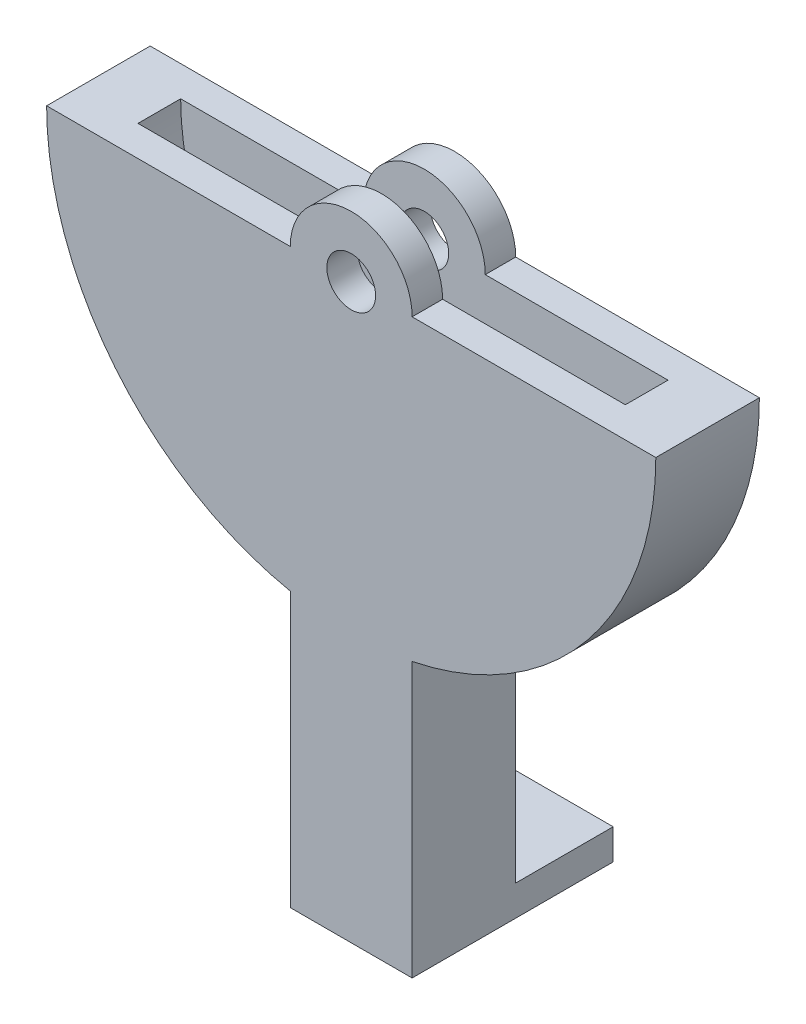
ISO-10303-21;
HEADER;
FILE_DESCRIPTION(('STEP AP214'),'2;1');
FILE_NAME('part.step','',(''),(''),'','','');
FILE_SCHEMA(('AUTOMOTIVE_DESIGN { 1 0 10303 214 1 1 1 1 }'));
ENDSEC;
DATA;
#1=APPLICATION_CONTEXT('core data for automotive mechanical design processes');
#2=APPLICATION_PROTOCOL_DEFINITION('international standard','automotive_design',2000,#1);
#3=PRODUCT_CONTEXT('',#1,'mechanical');
#4=PRODUCT('Part','Part','',(#3));
#5=PRODUCT_RELATED_PRODUCT_CATEGORY('part','',(#4));
#6=PRODUCT_DEFINITION_FORMATION('','',#4);
#7=PRODUCT_DEFINITION_CONTEXT('part definition',#1,'design');
#8=PRODUCT_DEFINITION('design','',#6,#7);
#9=PRODUCT_DEFINITION_SHAPE('','',#8);
#10=(LENGTH_UNIT() NAMED_UNIT(*) SI_UNIT(.MILLI.,.METRE.));
#11=(NAMED_UNIT(*) PLANE_ANGLE_UNIT() SI_UNIT($,.RADIAN.));
#12=(NAMED_UNIT(*) SI_UNIT($,.STERADIAN.) SOLID_ANGLE_UNIT());
#13=UNCERTAINTY_MEASURE_WITH_UNIT(LENGTH_MEASURE(1.E-05),#10,'distance_accuracy_value','');
#14=(GEOMETRIC_REPRESENTATION_CONTEXT(3) GLOBAL_UNCERTAINTY_ASSIGNED_CONTEXT((#13)) GLOBAL_UNIT_ASSIGNED_CONTEXT((#10,
#11,#12)) REPRESENTATION_CONTEXT('',''));
#15=CARTESIAN_POINT('',(0.,0.,0.));
#16=DIRECTION('',(0.,0.,1.));
#17=DIRECTION('',(1.,0.,0.));
#18=AXIS2_PLACEMENT_3D('',#15,#16,#17);
#19=CARTESIAN_POINT('',(0.,0.,5.));
#20=DIRECTION('',(0.,0.,-1.));
#21=DIRECTION('',(-1.,0.,0.));
#22=AXIS2_PLACEMENT_3D('',#19,#20,#21);
#23=CYLINDRICAL_SURFACE('',#22,50.);
#24=DIRECTION('',(0.,0.,1.));
#25=VECTOR('',#24,1.);
#26=CARTESIAN_POINT('',(-9.99999999999999,-48.9897948556636,0.));
#27=LINE('',#26,#25);
#28=CARTESIAN_POINT('',(-9.99999999999999,-48.9897948556636,0.));
#29=VERTEX_POINT('',#28);
#30=CARTESIAN_POINT('',(-9.99999999999999,-48.9897948556636,17.));
#31=VERTEX_POINT('',#30);
#32=EDGE_CURVE('E179',#29,#31,#27,.T.);
#33=ORIENTED_EDGE('',*,*,#32,.T.);
#34=CARTESIAN_POINT('',(0.,0.,17.));
#35=DIRECTION('',(0.,0.,1.));
#36=DIRECTION('',(1.,0.,0.));
#37=AXIS2_PLACEMENT_3D('',#34,#35,#36);
#38=CIRCLE('',#37,50.);
#39=CARTESIAN_POINT('',(-50.,0.,17.));
#40=VERTEX_POINT('',#39);
#41=EDGE_CURVE('E190',#40,#31,#38,.T.);
#42=ORIENTED_EDGE('',*,*,#41,.F.);
#43=DIRECTION('',(0.,0.,-1.));
#44=VECTOR('',#43,1.);
#45=CARTESIAN_POINT('',(-50.,0.,5.));
#46=LINE('',#45,#44);
#47=CARTESIAN_POINT('',(-50.,0.,0.));
#48=VERTEX_POINT('',#47);
#49=EDGE_CURVE('E237',#40,#48,#46,.T.);
#50=ORIENTED_EDGE('',*,*,#49,.T.);
#51=CARTESIAN_POINT('',(0.,0.,0.));
#52=DIRECTION('',(0.,0.,1.));
#53=DIRECTION('',(1.,0.,0.));
#54=AXIS2_PLACEMENT_3D('',#51,#52,#53);
#55=CIRCLE('',#54,50.);
#56=EDGE_CURVE('E238',#48,#29,#55,.T.);
#57=ORIENTED_EDGE('',*,*,#56,.T.);
#58=EDGE_LOOP('',(#33,#42,#50,#57));
#59=FACE_BOUND('',#58,.T.);
#60=ADVANCED_FACE('F39',(#59),#23,.T.);
#61=CARTESIAN_POINT('',(0.,0.,5.));
#62=DIRECTION('',(0.,0.,1.));
#63=DIRECTION('',(1.,0.,0.));
#64=AXIS2_PLACEMENT_3D('',#61,#62,#63);
#65=PLANE('',#64);
#66=CARTESIAN_POINT('',(0.,0.,5.));
#67=DIRECTION('',(0.,0.,1.));
#68=DIRECTION('',(1.,0.,0.));
#69=AXIS2_PLACEMENT_3D('',#66,#67,#68);
#70=CIRCLE('',#69,4.);
#71=CARTESIAN_POINT('',(4.,0.,5.));
#72=VERTEX_POINT('',#71);
#73=EDGE_CURVE('E224',#72,#72,#70,.T.);
#74=ORIENTED_EDGE('',*,*,#73,.F.);
#75=EDGE_LOOP('',(#74));
#76=FACE_BOUND('',#75,.T.);
#77=CARTESIAN_POINT('',(0.,0.,5.));
#78=DIRECTION('',(0.,0.,-1.));
#79=DIRECTION('',(1.,0.,0.));
#80=AXIS2_PLACEMENT_3D('',#77,#78,#79);
#81=CIRCLE('',#80,40.);
#82=CARTESIAN_POINT('',(40.,0.,5.));
#83=VERTEX_POINT('',#82);
#84=CARTESIAN_POINT('',(-40.,0.,5.));
#85=VERTEX_POINT('',#84);
#86=EDGE_CURVE('E62',#83,#85,#81,.T.);
#87=ORIENTED_EDGE('',*,*,#86,.F.);
#88=DIRECTION('',(-1.,0.,0.));
#89=VECTOR('',#88,1.);
#90=CARTESIAN_POINT('',(10.,0.,5.));
#91=LINE('',#90,#89);
#92=CARTESIAN_POINT('',(10.,0.,5.));
#93=VERTEX_POINT('',#92);
#94=EDGE_CURVE('E230',#83,#93,#91,.T.);
#95=ORIENTED_EDGE('',*,*,#94,.T.);
#96=CARTESIAN_POINT('',(0.,0.,5.));
#97=DIRECTION('',(0.,0.,1.));
#98=DIRECTION('',(1.,0.,0.));
#99=AXIS2_PLACEMENT_3D('',#96,#97,#98);
#100=CIRCLE('',#99,10.);
#101=CARTESIAN_POINT('',(-10.,0.,5.));
#102=VERTEX_POINT('',#101);
#103=EDGE_CURVE('E232',#93,#102,#100,.T.);
#104=ORIENTED_EDGE('',*,*,#103,.T.);
#105=DIRECTION('',(-1.,0.,0.));
#106=VECTOR('',#105,1.);
#107=CARTESIAN_POINT('',(-50.,0.,5.));
#108=LINE('',#107,#106);
#109=EDGE_CURVE('E235',#102,#85,#108,.T.);
#110=ORIENTED_EDGE('',*,*,#109,.T.);
#111=EDGE_LOOP('',(#87,#95,#104,#110));
#112=FACE_BOUND('',#111,.T.);
#113=ADVANCED_FACE('F285',(#76,#112),#65,.T.);
#114=CARTESIAN_POINT('',(0.,0.,0.));
#115=DIRECTION('',(0.,0.,1.));
#116=DIRECTION('',(1.,0.,0.));
#117=AXIS2_PLACEMENT_3D('',#114,#115,#116);
#118=PLANE('',#117);
#119=ORIENTED_EDGE('',*,*,#56,.F.);
#120=DIRECTION('',(-1.,0.,0.));
#121=VECTOR('',#120,1.);
#122=CARTESIAN_POINT('',(-50.,0.,0.));
#123=LINE('',#122,#121);
#124=CARTESIAN_POINT('',(-10.,0.,0.));
#125=VERTEX_POINT('',#124);
#126=EDGE_CURVE('E233',#125,#48,#123,.T.);
#127=ORIENTED_EDGE('',*,*,#126,.F.);
#128=CARTESIAN_POINT('',(0.,0.,0.));
#129=DIRECTION('',(0.,0.,1.));
#130=DIRECTION('',(1.,0.,0.));
#131=AXIS2_PLACEMENT_3D('',#128,#129,#130);
#132=CIRCLE('',#131,10.);
#133=CARTESIAN_POINT('',(10.,0.,0.));
#134=VERTEX_POINT('',#133);
#135=EDGE_CURVE('E243',#134,#125,#132,.T.);
#136=ORIENTED_EDGE('',*,*,#135,.F.);
#137=DIRECTION('',(-1.,0.,0.));
#138=VECTOR('',#137,1.);
#139=CARTESIAN_POINT('',(10.,0.,0.));
#140=LINE('',#139,#138);
#141=CARTESIAN_POINT('',(50.,0.,0.));
#142=VERTEX_POINT('',#141);
#143=EDGE_CURVE('E241',#142,#134,#140,.T.);
#144=ORIENTED_EDGE('',*,*,#143,.F.);
#145=CARTESIAN_POINT('',(10.,-48.9897948556636,0.));
#146=VERTEX_POINT('',#145);
#147=EDGE_CURVE('E227',#146,#142,#55,.T.);
#148=ORIENTED_EDGE('',*,*,#147,.F.);
#149=DIRECTION('',(0.,1.,0.));
#150=VECTOR('',#149,1.);
#151=CARTESIAN_POINT('',(10.,0.,0.));
#152=LINE('',#151,#150);
#153=CARTESIAN_POINT('',(10.,-88.9897948556635,0.));
#154=VERTEX_POINT('',#153);
#155=EDGE_CURVE('E175',#154,#146,#152,.T.);
#156=ORIENTED_EDGE('',*,*,#155,.F.);
#157=DIRECTION('',(-1.,0.,0.));
#158=VECTOR('',#157,1.);
#159=CARTESIAN_POINT('',(0.,-88.9897948556635,0.));
#160=LINE('',#159,#158);
#161=CARTESIAN_POINT('',(-10.,-88.9897948556635,0.));
#162=VERTEX_POINT('',#161);
#163=EDGE_CURVE('E172',#154,#162,#160,.T.);
#164=ORIENTED_EDGE('',*,*,#163,.T.);
#165=DIRECTION('',(0.,1.,0.));
#166=VECTOR('',#165,1.);
#167=CARTESIAN_POINT('',(-9.99999999999997,0.,0.));
#168=LINE('',#167,#166);
#169=EDGE_CURVE('E170',#162,#29,#168,.T.);
#170=ORIENTED_EDGE('',*,*,#169,.T.);
#171=EDGE_LOOP('',(#119,#127,#136,#144,#148,#156,#164,#170));
#172=FACE_BOUND('',#171,.T.);
#173=CARTESIAN_POINT('',(0.,0.,0.));
#174=DIRECTION('',(0.,0.,1.));
#175=DIRECTION('',(1.,0.,0.));
#176=AXIS2_PLACEMENT_3D('',#173,#174,#175);
#177=CIRCLE('',#176,4.);
#178=CARTESIAN_POINT('',(4.,0.,0.));
#179=VERTEX_POINT('',#178);
#180=EDGE_CURVE('E223',#179,#179,#177,.T.);
#181=ORIENTED_EDGE('',*,*,#180,.T.);
#182=EDGE_LOOP('',(#181));
#183=FACE_BOUND('',#182,.T.);
#184=ADVANCED_FACE('F262',(#172,#183),#118,.F.);
#185=CARTESIAN_POINT('',(10.,-48.9897948556636,17.));
#186=VERTEX_POINT('',#185);
#187=CARTESIAN_POINT('',(50.,0.,17.));
#188=VERTEX_POINT('',#187);
#189=EDGE_CURVE('E194',#186,#188,#38,.T.);
#190=ORIENTED_EDGE('',*,*,#189,.F.);
#191=DIRECTION('',(0.,0.,1.));
#192=VECTOR('',#191,1.);
#193=CARTESIAN_POINT('',(10.,-48.9897948556636,0.));
#194=LINE('',#193,#192);
#195=EDGE_CURVE('E176',#146,#186,#194,.T.);
#196=ORIENTED_EDGE('',*,*,#195,.F.);
#197=ORIENTED_EDGE('',*,*,#147,.T.);
#198=DIRECTION('',(0.,0.,-1.));
#199=VECTOR('',#198,1.);
#200=CARTESIAN_POINT('',(50.,0.,5.));
#201=LINE('',#200,#199);
#202=EDGE_CURVE('E11',#188,#142,#201,.T.);
#203=ORIENTED_EDGE('',*,*,#202,.F.);
#204=EDGE_LOOP('',(#190,#196,#197,#203));
#205=FACE_BOUND('',#204,.T.);
#206=ADVANCED_FACE('F41',(#205),#23,.T.);
#207=CARTESIAN_POINT('',(10.,0.,5.));
#208=DIRECTION('',(0.,-1.,0.));
#209=DIRECTION('',(0.,0.,-1.));
#210=AXIS2_PLACEMENT_3D('',#207,#208,#209);
#211=PLANE('',#210);
#212=ORIENTED_EDGE('',*,*,#143,.T.);
#213=DIRECTION('',(0.,0.,-1.));
#214=VECTOR('',#213,1.);
#215=CARTESIAN_POINT('',(10.,0.,5.));
#216=LINE('',#215,#214);
#217=EDGE_CURVE('E47',#93,#134,#216,.T.);
#218=ORIENTED_EDGE('',*,*,#217,.F.);
#219=ORIENTED_EDGE('',*,*,#94,.F.);
#220=DIRECTION('',(0.,0.,-1.));
#221=VECTOR('',#220,1.);
#222=CARTESIAN_POINT('',(40.,0.,12.));
#223=LINE('',#222,#221);
#224=CARTESIAN_POINT('',(40.,0.,12.));
#225=VERTEX_POINT('',#224);
#226=EDGE_CURVE('E220',#225,#83,#223,.T.);
#227=ORIENTED_EDGE('',*,*,#226,.F.);
#228=DIRECTION('',(-1.,0.,0.));
#229=VECTOR('',#228,1.);
#230=CARTESIAN_POINT('',(10.,0.,12.));
#231=LINE('',#230,#229);
#232=CARTESIAN_POINT('',(10.,0.,12.));
#233=VERTEX_POINT('',#232);
#234=EDGE_CURVE('E187',#225,#233,#231,.T.);
#235=ORIENTED_EDGE('',*,*,#234,.T.);
#236=DIRECTION('',(0.,0.,-1.));
#237=VECTOR('',#236,1.);
#238=CARTESIAN_POINT('',(10.,0.,17.));
#239=LINE('',#238,#237);
#240=CARTESIAN_POINT('',(10.,0.,17.));
#241=VERTEX_POINT('',#240);
#242=EDGE_CURVE('E210',#241,#233,#239,.T.);
#243=ORIENTED_EDGE('',*,*,#242,.F.);
#244=DIRECTION('',(-1.,0.,0.));
#245=VECTOR('',#244,1.);
#246=CARTESIAN_POINT('',(10.,0.,17.));
#247=LINE('',#246,#245);
#248=EDGE_CURVE('E193',#188,#241,#247,.T.);
#249=ORIENTED_EDGE('',*,*,#248,.F.);
#250=ORIENTED_EDGE('',*,*,#202,.T.);
#251=EDGE_LOOP('',(#212,#218,#219,#227,#235,#243,#249,#250));
#252=FACE_BOUND('',#251,.T.);
#253=ADVANCED_FACE('F286',(#252),#211,.F.);
#254=CARTESIAN_POINT('',(0.,0.,5.));
#255=DIRECTION('',(0.,0.,-1.));
#256=DIRECTION('',(-1.,0.,0.));
#257=AXIS2_PLACEMENT_3D('',#254,#255,#256);
#258=CYLINDRICAL_SURFACE('',#257,10.);
#259=ORIENTED_EDGE('',*,*,#135,.T.);
#260=DIRECTION('',(0.,0.,-1.));
#261=VECTOR('',#260,1.);
#262=CARTESIAN_POINT('',(-10.,0.,5.));
#263=LINE('',#262,#261);
#264=EDGE_CURVE('E248',#102,#125,#263,.T.);
#265=ORIENTED_EDGE('',*,*,#264,.F.);
#266=ORIENTED_EDGE('',*,*,#103,.F.);
#267=ORIENTED_EDGE('',*,*,#217,.T.);
#268=EDGE_LOOP('',(#259,#265,#266,#267));
#269=FACE_BOUND('',#268,.T.);
#270=ADVANCED_FACE('F255',(#269),#258,.T.);
#271=CARTESIAN_POINT('',(-50.,0.,5.));
#272=DIRECTION('',(0.,-1.,0.));
#273=DIRECTION('',(0.,0.,-1.));
#274=AXIS2_PLACEMENT_3D('',#271,#272,#273);
#275=PLANE('',#274);
#276=ORIENTED_EDGE('',*,*,#126,.T.);
#277=ORIENTED_EDGE('',*,*,#49,.F.);
#278=DIRECTION('',(-1.,0.,0.));
#279=VECTOR('',#278,1.);
#280=CARTESIAN_POINT('',(-50.,0.,17.));
#281=LINE('',#280,#279);
#282=CARTESIAN_POINT('',(-10.,0.,17.));
#283=VERTEX_POINT('',#282);
#284=EDGE_CURVE('E198',#283,#40,#281,.T.);
#285=ORIENTED_EDGE('',*,*,#284,.F.);
#286=DIRECTION('',(0.,0.,-1.));
#287=VECTOR('',#286,1.);
#288=CARTESIAN_POINT('',(-10.,0.,17.));
#289=LINE('',#288,#287);
#290=CARTESIAN_POINT('',(-10.,0.,12.));
#291=VERTEX_POINT('',#290);
#292=EDGE_CURVE('E201',#283,#291,#289,.T.);
#293=ORIENTED_EDGE('',*,*,#292,.T.);
#294=DIRECTION('',(-1.,0.,0.));
#295=VECTOR('',#294,1.);
#296=CARTESIAN_POINT('',(-50.,0.,12.));
#297=LINE('',#296,#295);
#298=CARTESIAN_POINT('',(-40.,0.,12.));
#299=VERTEX_POINT('',#298);
#300=EDGE_CURVE('E205',#291,#299,#297,.T.);
#301=ORIENTED_EDGE('',*,*,#300,.T.);
#302=DIRECTION('',(0.,0.,-1.));
#303=VECTOR('',#302,1.);
#304=CARTESIAN_POINT('',(-40.,0.,12.));
#305=LINE('',#304,#303);
#306=EDGE_CURVE('E216',#299,#85,#305,.T.);
#307=ORIENTED_EDGE('',*,*,#306,.T.);
#308=ORIENTED_EDGE('',*,*,#109,.F.);
#309=ORIENTED_EDGE('',*,*,#264,.T.);
#310=EDGE_LOOP('',(#276,#277,#285,#293,#301,#307,#308,#309));
#311=FACE_BOUND('',#310,.T.);
#312=ADVANCED_FACE('F266',(#311),#275,.F.);
#313=CARTESIAN_POINT('',(0.,0.,5.));
#314=DIRECTION('',(0.,0.,-1.));
#315=DIRECTION('',(-1.,0.,0.));
#316=AXIS2_PLACEMENT_3D('',#313,#314,#315);
#317=CYLINDRICAL_SURFACE('',#316,4.);
#318=ORIENTED_EDGE('',*,*,#73,.T.);
#319=EDGE_LOOP('',(#318));
#320=FACE_BOUND('',#319,.T.);
#321=ORIENTED_EDGE('',*,*,#180,.F.);
#322=EDGE_LOOP('',(#321));
#323=FACE_BOUND('',#322,.T.);
#324=ADVANCED_FACE('F347',(#320,#323),#317,.F.);
#325=CARTESIAN_POINT('',(0.,0.,12.));
#326=DIRECTION('',(0.,0.,-1.));
#327=DIRECTION('',(-1.,0.,0.));
#328=AXIS2_PLACEMENT_3D('',#325,#326,#327);
#329=CYLINDRICAL_SURFACE('',#328,40.);
#330=ORIENTED_EDGE('',*,*,#86,.T.);
#331=ORIENTED_EDGE('',*,*,#306,.F.);
#332=CARTESIAN_POINT('',(0.,0.,12.));
#333=DIRECTION('',(0.,0.,-1.));
#334=DIRECTION('',(1.,0.,0.));
#335=AXIS2_PLACEMENT_3D('',#332,#333,#334);
#336=CIRCLE('',#335,40.);
#337=EDGE_CURVE('E213',#225,#299,#336,.T.);
#338=ORIENTED_EDGE('',*,*,#337,.F.);
#339=ORIENTED_EDGE('',*,*,#226,.T.);
#340=EDGE_LOOP('',(#330,#331,#338,#339));
#341=FACE_BOUND('',#340,.T.);
#342=ADVANCED_FACE('F284',(#341),#329,.F.);
#343=CARTESIAN_POINT('',(0.,0.,12.));
#344=DIRECTION('',(0.,0.,1.));
#345=DIRECTION('',(1.,0.,0.));
#346=AXIS2_PLACEMENT_3D('',#343,#344,#345);
#347=PLANE('',#346);
#348=CARTESIAN_POINT('',(0.,0.,12.));
#349=DIRECTION('',(0.,0.,1.));
#350=DIRECTION('',(1.,0.,0.));
#351=AXIS2_PLACEMENT_3D('',#348,#349,#350);
#352=CIRCLE('',#351,4.);
#353=CARTESIAN_POINT('',(4.,0.,12.));
#354=VERTEX_POINT('',#353);
#355=EDGE_CURVE('E182',#354,#354,#352,.T.);
#356=ORIENTED_EDGE('',*,*,#355,.T.);
#357=EDGE_LOOP('',(#356));
#358=FACE_BOUND('',#357,.T.);
#359=ORIENTED_EDGE('',*,*,#234,.F.);
#360=ORIENTED_EDGE('',*,*,#337,.T.);
#361=ORIENTED_EDGE('',*,*,#300,.F.);
#362=CARTESIAN_POINT('',(0.,0.,12.));
#363=DIRECTION('',(0.,0.,1.));
#364=DIRECTION('',(1.,0.,0.));
#365=AXIS2_PLACEMENT_3D('',#362,#363,#364);
#366=CIRCLE('',#365,10.);
#367=EDGE_CURVE('E203',#233,#291,#366,.T.);
#368=ORIENTED_EDGE('',*,*,#367,.F.);
#369=EDGE_LOOP('',(#359,#360,#361,#368));
#370=FACE_BOUND('',#369,.T.);
#371=ADVANCED_FACE('F281',(#358,#370),#347,.F.);
#372=CARTESIAN_POINT('',(0.,0.,17.));
#373=DIRECTION('',(0.,0.,1.));
#374=DIRECTION('',(1.,0.,0.));
#375=AXIS2_PLACEMENT_3D('',#372,#373,#374);
#376=PLANE('',#375);
#377=ORIENTED_EDGE('',*,*,#41,.T.);
#378=DIRECTION('',(0.,1.,0.));
#379=VECTOR('',#378,1.);
#380=CARTESIAN_POINT('',(-9.99999999999997,0.,17.));
#381=LINE('',#380,#379);
#382=CARTESIAN_POINT('',(-10.,-93.9897948556636,17.));
#383=VERTEX_POINT('',#382);
#384=EDGE_CURVE('E164',#383,#31,#381,.T.);
#385=ORIENTED_EDGE('',*,*,#384,.F.);
#386=DIRECTION('',(-1.,0.,0.));
#387=VECTOR('',#386,1.);
#388=CARTESIAN_POINT('',(-10.,-93.9897948556636,17.));
#389=LINE('',#388,#387);
#390=CARTESIAN_POINT('',(10.,-93.9897948556636,17.));
#391=VERTEX_POINT('',#390);
#392=EDGE_CURVE('E156',#391,#383,#389,.T.);
#393=ORIENTED_EDGE('',*,*,#392,.F.);
#394=DIRECTION('',(0.,1.,0.));
#395=VECTOR('',#394,1.);
#396=CARTESIAN_POINT('',(10.,0.,17.));
#397=LINE('',#396,#395);
#398=EDGE_CURVE('E54',#391,#186,#397,.T.);
#399=ORIENTED_EDGE('',*,*,#398,.T.);
#400=ORIENTED_EDGE('',*,*,#189,.T.);
#401=ORIENTED_EDGE('',*,*,#248,.T.);
#402=CARTESIAN_POINT('',(0.,0.,17.));
#403=DIRECTION('',(0.,0.,1.));
#404=DIRECTION('',(1.,0.,0.));
#405=AXIS2_PLACEMENT_3D('',#402,#403,#404);
#406=CIRCLE('',#405,10.);
#407=EDGE_CURVE('E196',#241,#283,#406,.T.);
#408=ORIENTED_EDGE('',*,*,#407,.T.);
#409=ORIENTED_EDGE('',*,*,#284,.T.);
#410=EDGE_LOOP('',(#377,#385,#393,#399,#400,#401,#408,#409));
#411=FACE_BOUND('',#410,.T.);
#412=CARTESIAN_POINT('',(0.,0.,17.));
#413=DIRECTION('',(0.,0.,1.));
#414=DIRECTION('',(1.,0.,0.));
#415=AXIS2_PLACEMENT_3D('',#412,#413,#414);
#416=CIRCLE('',#415,4.);
#417=CARTESIAN_POINT('',(4.,0.,17.));
#418=VERTEX_POINT('',#417);
#419=EDGE_CURVE('E184',#418,#418,#416,.T.);
#420=ORIENTED_EDGE('',*,*,#419,.F.);
#421=EDGE_LOOP('',(#420));
#422=FACE_BOUND('',#421,.T.);
#423=ADVANCED_FACE('F272',(#411,#422),#376,.T.);
#424=CARTESIAN_POINT('',(0.,0.,17.));
#425=DIRECTION('',(0.,0.,-1.));
#426=DIRECTION('',(-1.,0.,0.));
#427=AXIS2_PLACEMENT_3D('',#424,#425,#426);
#428=CYLINDRICAL_SURFACE('',#427,10.);
#429=ORIENTED_EDGE('',*,*,#367,.T.);
#430=ORIENTED_EDGE('',*,*,#292,.F.);
#431=ORIENTED_EDGE('',*,*,#407,.F.);
#432=ORIENTED_EDGE('',*,*,#242,.T.);
#433=EDGE_LOOP('',(#429,#430,#431,#432));
#434=FACE_BOUND('',#433,.T.);
#435=ADVANCED_FACE('F289',(#434),#428,.T.);
#436=CARTESIAN_POINT('',(0.,0.,17.));
#437=DIRECTION('',(0.,0.,-1.));
#438=DIRECTION('',(-1.,0.,0.));
#439=AXIS2_PLACEMENT_3D('',#436,#437,#438);
#440=CYLINDRICAL_SURFACE('',#439,4.);
#441=ORIENTED_EDGE('',*,*,#419,.T.);
#442=EDGE_LOOP('',(#441));
#443=FACE_BOUND('',#442,.T.);
#444=ORIENTED_EDGE('',*,*,#355,.F.);
#445=EDGE_LOOP('',(#444));
#446=FACE_BOUND('',#445,.T.);
#447=ADVANCED_FACE('F291',(#443,#446),#440,.F.);
#448=CARTESIAN_POINT('',(-9.99999999999997,0.,0.));
#449=DIRECTION('',(1.,0.,0.));
#450=DIRECTION('',(0.,1.,0.));
#451=AXIS2_PLACEMENT_3D('',#448,#449,#450);
#452=PLANE('',#451);
#453=ORIENTED_EDGE('',*,*,#384,.T.);
#454=ORIENTED_EDGE('',*,*,#32,.F.);
#455=ORIENTED_EDGE('',*,*,#169,.F.);
#456=DIRECTION('',(0.,0.,-1.));
#457=VECTOR('',#456,1.);
#458=CARTESIAN_POINT('',(-10.,-88.9897948556635,17.));
#459=LINE('',#458,#457);
#460=CARTESIAN_POINT('',(-10.,-88.9897948556635,-16.));
#461=VERTEX_POINT('',#460);
#462=EDGE_CURVE('E162',#162,#461,#459,.T.);
#463=ORIENTED_EDGE('',*,*,#462,.T.);
#464=DIRECTION('',(0.,1.,0.));
#465=VECTOR('',#464,1.);
#466=CARTESIAN_POINT('',(-10.,-93.9897948556636,-16.));
#467=LINE('',#466,#465);
#468=CARTESIAN_POINT('',(-10.,-93.9897948556636,-16.));
#469=VERTEX_POINT('',#468);
#470=EDGE_CURVE('E144',#469,#461,#467,.T.);
#471=ORIENTED_EDGE('',*,*,#470,.F.);
#472=DIRECTION('',(0.,0.,-1.));
#473=VECTOR('',#472,1.);
#474=CARTESIAN_POINT('',(-10.,-93.9897948556636,17.));
#475=LINE('',#474,#473);
#476=EDGE_CURVE('E151',#383,#469,#475,.T.);
#477=ORIENTED_EDGE('',*,*,#476,.F.);
#478=EDGE_LOOP('',(#453,#454,#455,#463,#471,#477));
#479=FACE_BOUND('',#478,.T.);
#480=ADVANCED_FACE('F160',(#479),#452,.F.);
#481=CARTESIAN_POINT('',(10.,0.,0.));
#482=DIRECTION('',(1.,0.,0.));
#483=DIRECTION('',(0.,1.,0.));
#484=AXIS2_PLACEMENT_3D('',#481,#482,#483);
#485=PLANE('',#484);
#486=ORIENTED_EDGE('',*,*,#398,.F.);
#487=DIRECTION('',(0.,0.,1.));
#488=VECTOR('',#487,1.);
#489=CARTESIAN_POINT('',(10.,-93.9897948556636,17.));
#490=LINE('',#489,#488);
#491=CARTESIAN_POINT('',(10.,-93.9897948556636,-16.));
#492=VERTEX_POINT('',#491);
#493=EDGE_CURVE('E150',#492,#391,#490,.T.);
#494=ORIENTED_EDGE('',*,*,#493,.F.);
#495=DIRECTION('',(0.,1.,0.));
#496=VECTOR('',#495,1.);
#497=CARTESIAN_POINT('',(10.,-93.9897948556636,-16.));
#498=LINE('',#497,#496);
#499=CARTESIAN_POINT('',(10.,-88.9897948556635,-16.));
#500=VERTEX_POINT('',#499);
#501=EDGE_CURVE('E146',#492,#500,#498,.T.);
#502=ORIENTED_EDGE('',*,*,#501,.T.);
#503=DIRECTION('',(0.,0.,1.));
#504=VECTOR('',#503,1.);
#505=CARTESIAN_POINT('',(10.,-88.9897948556635,17.));
#506=LINE('',#505,#504);
#507=EDGE_CURVE('E158',#500,#154,#506,.T.);
#508=ORIENTED_EDGE('',*,*,#507,.T.);
#509=ORIENTED_EDGE('',*,*,#155,.T.);
#510=ORIENTED_EDGE('',*,*,#195,.T.);
#511=EDGE_LOOP('',(#486,#494,#502,#508,#509,#510));
#512=FACE_BOUND('',#511,.T.);
#513=ADVANCED_FACE('F321',(#512),#485,.T.);
#514=CARTESIAN_POINT('',(-10.,-93.9897948556636,-16.));
#515=DIRECTION('',(0.,0.,1.));
#516=DIRECTION('',(1.,0.,0.));
#517=AXIS2_PLACEMENT_3D('',#514,#515,#516);
#518=PLANE('',#517);
#519=DIRECTION('',(1.,0.,0.));
#520=VECTOR('',#519,1.);
#521=CARTESIAN_POINT('',(-10.,-88.9897948556635,-16.));
#522=LINE('',#521,#520);
#523=EDGE_CURVE('E324',#461,#500,#522,.T.);
#524=ORIENTED_EDGE('',*,*,#523,.T.);
#525=ORIENTED_EDGE('',*,*,#501,.F.);
#526=DIRECTION('',(1.,0.,0.));
#527=VECTOR('',#526,1.);
#528=CARTESIAN_POINT('',(-10.,-93.9897948556636,-16.));
#529=LINE('',#528,#527);
#530=EDGE_CURVE('E140',#469,#492,#529,.T.);
#531=ORIENTED_EDGE('',*,*,#530,.F.);
#532=ORIENTED_EDGE('',*,*,#470,.T.);
#533=EDGE_LOOP('',(#524,#525,#531,#532));
#534=FACE_BOUND('',#533,.T.);
#535=ADVANCED_FACE('F142',(#534),#518,.F.);
#536=CARTESIAN_POINT('',(0.,-93.9897948556636,0.));
#537=DIRECTION('',(0.,-1.,0.));
#538=DIRECTION('',(0.,0.,-1.));
#539=AXIS2_PLACEMENT_3D('',#536,#537,#538);
#540=PLANE('',#539);
#541=ORIENTED_EDGE('',*,*,#476,.T.);
#542=ORIENTED_EDGE('',*,*,#530,.T.);
#543=ORIENTED_EDGE('',*,*,#493,.T.);
#544=ORIENTED_EDGE('',*,*,#392,.T.);
#545=EDGE_LOOP('',(#541,#542,#543,#544));
#546=FACE_BOUND('',#545,.T.);
#547=ADVANCED_FACE('F155',(#546),#540,.T.);
#548=CARTESIAN_POINT('',(0.,-88.9897948556635,0.));
#549=DIRECTION('',(0.,-1.,0.));
#550=DIRECTION('',(0.,0.,-1.));
#551=AXIS2_PLACEMENT_3D('',#548,#549,#550);
#552=PLANE('',#551);
#553=ORIENTED_EDGE('',*,*,#163,.F.);
#554=ORIENTED_EDGE('',*,*,#507,.F.);
#555=ORIENTED_EDGE('',*,*,#523,.F.);
#556=ORIENTED_EDGE('',*,*,#462,.F.);
#557=EDGE_LOOP('',(#553,#554,#555,#556));
#558=FACE_BOUND('',#557,.T.);
#559=ADVANCED_FACE('F329',(#558),#552,.F.);
#560=CLOSED_SHELL('',(#60,#113,#184,#206,#253,#270,#312,#324,#342,#371,#423,#435,#447,#480,#513,
#535,#547,#559));
#561=MANIFOLD_SOLID_BREP('B2',#560);
#562=ADVANCED_BREP_SHAPE_REPRESENTATION('',(#18,#561),#14);
#563=SHAPE_DEFINITION_REPRESENTATION(#9,#562);
ENDSEC;
END-ISO-10303-21;
